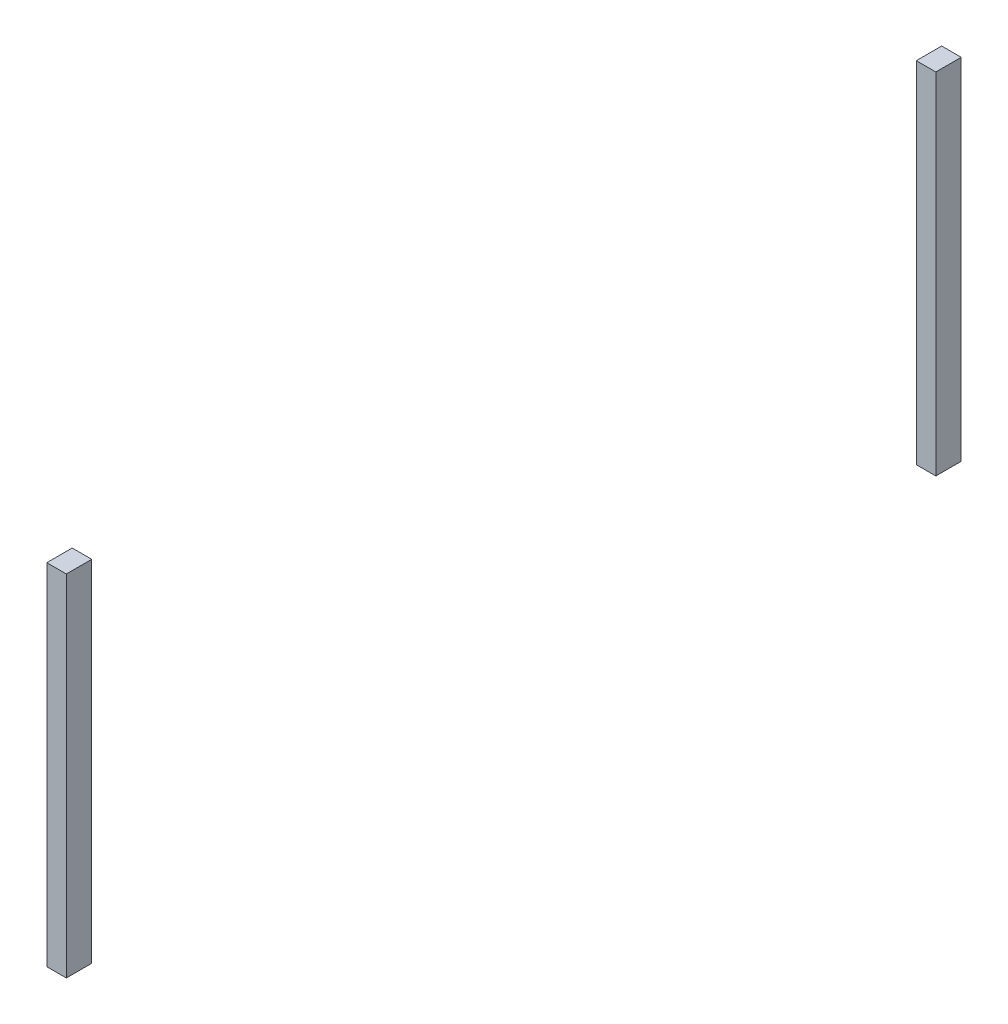
ISO-10303-21;
HEADER;
FILE_DESCRIPTION(('STEP AP214'),'2;1');
FILE_NAME('part.step','',(''),(''),'','','');
FILE_SCHEMA(('AUTOMOTIVE_DESIGN { 1 0 10303 214 1 1 1 1 }'));
ENDSEC;
DATA;
#1=APPLICATION_CONTEXT('core data for automotive mechanical design processes');
#2=APPLICATION_PROTOCOL_DEFINITION('international standard','automotive_design',2000,#1);
#3=PRODUCT_CONTEXT('',#1,'mechanical');
#4=PRODUCT('Part','Part','',(#3));
#5=PRODUCT_RELATED_PRODUCT_CATEGORY('part','',(#4));
#6=PRODUCT_DEFINITION_FORMATION('','',#4);
#7=PRODUCT_DEFINITION_CONTEXT('part definition',#1,'design');
#8=PRODUCT_DEFINITION('design','',#6,#7);
#9=PRODUCT_DEFINITION_SHAPE('','',#8);
#10=(LENGTH_UNIT() NAMED_UNIT(*) SI_UNIT(.MILLI.,.METRE.));
#11=(NAMED_UNIT(*) PLANE_ANGLE_UNIT() SI_UNIT($,.RADIAN.));
#12=(NAMED_UNIT(*) SI_UNIT($,.STERADIAN.) SOLID_ANGLE_UNIT());
#13=UNCERTAINTY_MEASURE_WITH_UNIT(LENGTH_MEASURE(1.E-05),#10,'distance_accuracy_value','');
#14=(GEOMETRIC_REPRESENTATION_CONTEXT(3) GLOBAL_UNCERTAINTY_ASSIGNED_CONTEXT((#13)) GLOBAL_UNIT_ASSIGNED_CONTEXT((#10,
#11,#12)) REPRESENTATION_CONTEXT('',''));
#15=CARTESIAN_POINT('',(0.,0.,0.));
#16=DIRECTION('',(0.,0.,1.));
#17=DIRECTION('',(1.,0.,0.));
#18=AXIS2_PLACEMENT_3D('',#15,#16,#17);
#19=CARTESIAN_POINT('',(-287.55,151.,561.6));
#20=DIRECTION('',(0.,1.,0.));
#21=DIRECTION('',(0.,0.,1.));
#22=AXIS2_PLACEMENT_3D('',#19,#20,#21);
#23=PLANE('',#22);
#24=DIRECTION('',(0.,0.,1.));
#25=VECTOR('',#24,1.);
#26=CARTESIAN_POINT('',(-256.75,151.,561.6));
#27=LINE('',#26,#25);
#28=CARTESIAN_POINT('',(-256.75,151.,561.6));
#29=VERTEX_POINT('',#28);
#30=CARTESIAN_POINT('',(-256.75,151.,601.6));
#31=VERTEX_POINT('',#30);
#32=EDGE_CURVE('E106',#29,#31,#27,.T.);
#33=ORIENTED_EDGE('',*,*,#32,.F.);
#34=DIRECTION('',(1.,0.,0.));
#35=VECTOR('',#34,1.);
#36=CARTESIAN_POINT('',(-287.55,151.,561.6));
#37=LINE('',#36,#35);
#38=CARTESIAN_POINT('',(-287.55,151.,561.6));
#39=VERTEX_POINT('',#38);
#40=EDGE_CURVE('E12',#39,#29,#37,.T.);
#41=ORIENTED_EDGE('',*,*,#40,.F.);
#42=DIRECTION('',(0.,0.,1.));
#43=VECTOR('',#42,1.);
#44=CARTESIAN_POINT('',(-287.55,151.,561.6));
#45=LINE('',#44,#43);
#46=CARTESIAN_POINT('',(-287.55,151.,601.6));
#47=VERTEX_POINT('',#46);
#48=EDGE_CURVE('E100',#39,#47,#45,.T.);
#49=ORIENTED_EDGE('',*,*,#48,.T.);
#50=DIRECTION('',(1.,0.,0.));
#51=VECTOR('',#50,1.);
#52=CARTESIAN_POINT('',(-287.55,151.,601.6));
#53=LINE('',#52,#51);
#54=EDGE_CURVE('E45',#47,#31,#53,.T.);
#55=ORIENTED_EDGE('',*,*,#54,.T.);
#56=EDGE_LOOP('',(#33,#41,#49,#55));
#57=FACE_BOUND('',#56,.T.);
#58=ADVANCED_FACE('F42',(#57),#23,.T.);
#59=CARTESIAN_POINT('',(-287.55,-400.,561.6));
#60=DIRECTION('',(0.,0.,-1.));
#61=DIRECTION('',(0.,1.,0.));
#62=AXIS2_PLACEMENT_3D('',#59,#60,#61);
#63=PLANE('',#62);
#64=DIRECTION('',(0.,1.,0.));
#65=VECTOR('',#64,1.);
#66=CARTESIAN_POINT('',(-256.75,-400.,561.6));
#67=LINE('',#66,#65);
#68=CARTESIAN_POINT('',(-256.75,-400.,561.6));
#69=VERTEX_POINT('',#68);
#70=EDGE_CURVE('E102',#69,#29,#67,.T.);
#71=ORIENTED_EDGE('',*,*,#70,.F.);
#72=DIRECTION('',(1.,0.,0.));
#73=VECTOR('',#72,1.);
#74=CARTESIAN_POINT('',(-287.55,-400.,561.6));
#75=LINE('',#74,#73);
#76=CARTESIAN_POINT('',(-287.55,-400.,561.6));
#77=VERTEX_POINT('',#76);
#78=EDGE_CURVE('E51',#77,#69,#75,.T.);
#79=ORIENTED_EDGE('',*,*,#78,.F.);
#80=DIRECTION('',(0.,1.,0.));
#81=VECTOR('',#80,1.);
#82=CARTESIAN_POINT('',(-287.55,-400.,561.6));
#83=LINE('',#82,#81);
#84=EDGE_CURVE('E97',#77,#39,#83,.T.);
#85=ORIENTED_EDGE('',*,*,#84,.T.);
#86=ORIENTED_EDGE('',*,*,#40,.T.);
#87=EDGE_LOOP('',(#71,#79,#85,#86));
#88=FACE_BOUND('',#87,.T.);
#89=ADVANCED_FACE('F116',(#88),#63,.T.);
#90=CARTESIAN_POINT('',(-287.55,-400.,601.6));
#91=DIRECTION('',(0.,-1.,0.));
#92=DIRECTION('',(0.,0.,-1.));
#93=AXIS2_PLACEMENT_3D('',#90,#91,#92);
#94=PLANE('',#93);
#95=DIRECTION('',(0.,0.,-1.));
#96=VECTOR('',#95,1.);
#97=CARTESIAN_POINT('',(-256.75,-400.,601.6));
#98=LINE('',#97,#96);
#99=CARTESIAN_POINT('',(-256.75,-400.,601.6));
#100=VERTEX_POINT('',#99);
#101=EDGE_CURVE('E92',#100,#69,#98,.T.);
#102=ORIENTED_EDGE('',*,*,#101,.F.);
#103=DIRECTION('',(1.,0.,0.));
#104=VECTOR('',#103,1.);
#105=CARTESIAN_POINT('',(-287.55,-400.,601.6));
#106=LINE('',#105,#104);
#107=CARTESIAN_POINT('',(-287.55,-400.,601.6));
#108=VERTEX_POINT('',#107);
#109=EDGE_CURVE('E87',#108,#100,#106,.T.);
#110=ORIENTED_EDGE('',*,*,#109,.F.);
#111=DIRECTION('',(0.,0.,-1.));
#112=VECTOR('',#111,1.);
#113=CARTESIAN_POINT('',(-287.55,-400.,601.6));
#114=LINE('',#113,#112);
#115=EDGE_CURVE('E90',#108,#77,#114,.T.);
#116=ORIENTED_EDGE('',*,*,#115,.T.);
#117=ORIENTED_EDGE('',*,*,#78,.T.);
#118=EDGE_LOOP('',(#102,#110,#116,#117));
#119=FACE_BOUND('',#118,.T.);
#120=ADVANCED_FACE('F89',(#119),#94,.T.);
#121=CARTESIAN_POINT('',(-287.55,151.,601.6));
#122=DIRECTION('',(0.,0.,1.));
#123=DIRECTION('',(0.,-1.,0.));
#124=AXIS2_PLACEMENT_3D('',#121,#122,#123);
#125=PLANE('',#124);
#126=DIRECTION('',(0.,-1.,0.));
#127=VECTOR('',#126,1.);
#128=CARTESIAN_POINT('',(-256.75,151.,601.6));
#129=LINE('',#128,#127);
#130=EDGE_CURVE('E109',#31,#100,#129,.T.);
#131=ORIENTED_EDGE('',*,*,#130,.F.);
#132=ORIENTED_EDGE('',*,*,#54,.F.);
#133=DIRECTION('',(0.,-1.,0.));
#134=VECTOR('',#133,1.);
#135=CARTESIAN_POINT('',(-287.55,151.,601.6));
#136=LINE('',#135,#134);
#137=EDGE_CURVE('E96',#47,#108,#136,.T.);
#138=ORIENTED_EDGE('',*,*,#137,.T.);
#139=ORIENTED_EDGE('',*,*,#109,.T.);
#140=EDGE_LOOP('',(#131,#132,#138,#139));
#141=FACE_BOUND('',#140,.T.);
#142=ADVANCED_FACE('F99',(#141),#125,.T.);
#143=CARTESIAN_POINT('',(-287.55,0.,0.));
#144=DIRECTION('',(1.,0.,0.));
#145=DIRECTION('',(0.,0.,-1.));
#146=AXIS2_PLACEMENT_3D('',#143,#144,#145);
#147=PLANE('',#146);
#148=ORIENTED_EDGE('',*,*,#48,.F.);
#149=ORIENTED_EDGE('',*,*,#84,.F.);
#150=ORIENTED_EDGE('',*,*,#115,.F.);
#151=ORIENTED_EDGE('',*,*,#137,.F.);
#152=EDGE_LOOP('',(#148,#149,#150,#151));
#153=FACE_BOUND('',#152,.T.);
#154=ADVANCED_FACE('F95',(#153),#147,.F.);
#155=CARTESIAN_POINT('',(-256.75,0.,0.));
#156=DIRECTION('',(1.,0.,0.));
#157=DIRECTION('',(0.,0.,-1.));
#158=AXIS2_PLACEMENT_3D('',#155,#156,#157);
#159=PLANE('',#158);
#160=ORIENTED_EDGE('',*,*,#32,.T.);
#161=ORIENTED_EDGE('',*,*,#130,.T.);
#162=ORIENTED_EDGE('',*,*,#101,.T.);
#163=ORIENTED_EDGE('',*,*,#70,.T.);
#164=EDGE_LOOP('',(#160,#161,#162,#163));
#165=FACE_BOUND('',#164,.T.);
#166=ADVANCED_FACE('F115',(#165),#159,.T.);
#167=CLOSED_SHELL('',(#58,#89,#120,#142,#154,#166));
#168=MANIFOLD_SOLID_BREP('B2',#167);
#169=CARTESIAN_POINT('',(-287.55,151.,1930.8));
#170=DIRECTION('',(0.,1.,0.));
#171=DIRECTION('',(0.,0.,1.));
#172=AXIS2_PLACEMENT_3D('',#169,#170,#171);
#173=PLANE('',#172);
#174=DIRECTION('',(0.,0.,1.));
#175=VECTOR('',#174,1.);
#176=CARTESIAN_POINT('',(-256.75,151.,1930.8));
#177=LINE('',#176,#175);
#178=CARTESIAN_POINT('',(-256.75,151.,1930.8));
#179=VERTEX_POINT('',#178);
#180=CARTESIAN_POINT('',(-256.75,151.,1970.8));
#181=VERTEX_POINT('',#180);
#182=EDGE_CURVE('E229',#179,#181,#177,.T.);
#183=ORIENTED_EDGE('',*,*,#182,.F.);
#184=DIRECTION('',(1.,0.,0.));
#185=VECTOR('',#184,1.);
#186=CARTESIAN_POINT('',(-287.55,151.,1930.8));
#187=LINE('',#186,#185);
#188=CARTESIAN_POINT('',(-287.55,151.,1930.8));
#189=VERTEX_POINT('',#188);
#190=EDGE_CURVE('E40',#189,#179,#187,.T.);
#191=ORIENTED_EDGE('',*,*,#190,.F.);
#192=DIRECTION('',(0.,0.,1.));
#193=VECTOR('',#192,1.);
#194=CARTESIAN_POINT('',(-287.55,151.,1930.8));
#195=LINE('',#194,#193);
#196=CARTESIAN_POINT('',(-287.55,151.,1970.8));
#197=VERTEX_POINT('',#196);
#198=EDGE_CURVE('E223',#189,#197,#195,.T.);
#199=ORIENTED_EDGE('',*,*,#198,.T.);
#200=DIRECTION('',(1.,0.,0.));
#201=VECTOR('',#200,1.);
#202=CARTESIAN_POINT('',(-287.55,151.,1970.8));
#203=LINE('',#202,#201);
#204=EDGE_CURVE('E168',#197,#181,#203,.T.);
#205=ORIENTED_EDGE('',*,*,#204,.T.);
#206=EDGE_LOOP('',(#183,#191,#199,#205));
#207=FACE_BOUND('',#206,.T.);
#208=ADVANCED_FACE('F165',(#207),#173,.T.);
#209=CARTESIAN_POINT('',(-287.55,-400.,1930.8));
#210=DIRECTION('',(0.,0.,-1.));
#211=DIRECTION('',(-1.,0.,0.));
#212=AXIS2_PLACEMENT_3D('',#209,#210,#211);
#213=PLANE('',#212);
#214=DIRECTION('',(0.,1.,0.));
#215=VECTOR('',#214,1.);
#216=CARTESIAN_POINT('',(-256.75,-400.,1930.8));
#217=LINE('',#216,#215);
#218=CARTESIAN_POINT('',(-256.75,-400.,1930.8));
#219=VERTEX_POINT('',#218);
#220=EDGE_CURVE('E225',#219,#179,#217,.T.);
#221=ORIENTED_EDGE('',*,*,#220,.F.);
#222=DIRECTION('',(1.,0.,0.));
#223=VECTOR('',#222,1.);
#224=CARTESIAN_POINT('',(-287.55,-400.,1930.8));
#225=LINE('',#224,#223);
#226=CARTESIAN_POINT('',(-287.55,-400.,1930.8));
#227=VERTEX_POINT('',#226);
#228=EDGE_CURVE('E174',#227,#219,#225,.T.);
#229=ORIENTED_EDGE('',*,*,#228,.F.);
#230=DIRECTION('',(0.,1.,0.));
#231=VECTOR('',#230,1.);
#232=CARTESIAN_POINT('',(-287.55,-400.,1930.8));
#233=LINE('',#232,#231);
#234=EDGE_CURVE('E220',#227,#189,#233,.T.);
#235=ORIENTED_EDGE('',*,*,#234,.T.);
#236=ORIENTED_EDGE('',*,*,#190,.T.);
#237=EDGE_LOOP('',(#221,#229,#235,#236));
#238=FACE_BOUND('',#237,.T.);
#239=ADVANCED_FACE('F239',(#238),#213,.T.);
#240=CARTESIAN_POINT('',(-287.55,-400.,1970.8));
#241=DIRECTION('',(0.,-1.,0.));
#242=DIRECTION('',(0.,0.,-1.));
#243=AXIS2_PLACEMENT_3D('',#240,#241,#242);
#244=PLANE('',#243);
#245=DIRECTION('',(0.,0.,-1.));
#246=VECTOR('',#245,1.);
#247=CARTESIAN_POINT('',(-256.75,-400.,1970.8));
#248=LINE('',#247,#246);
#249=CARTESIAN_POINT('',(-256.75,-400.,1970.8));
#250=VERTEX_POINT('',#249);
#251=EDGE_CURVE('E215',#250,#219,#248,.T.);
#252=ORIENTED_EDGE('',*,*,#251,.F.);
#253=DIRECTION('',(1.,0.,0.));
#254=VECTOR('',#253,1.);
#255=CARTESIAN_POINT('',(-287.55,-400.,1970.8));
#256=LINE('',#255,#254);
#257=CARTESIAN_POINT('',(-287.55,-400.,1970.8));
#258=VERTEX_POINT('',#257);
#259=EDGE_CURVE('E210',#258,#250,#256,.T.);
#260=ORIENTED_EDGE('',*,*,#259,.F.);
#261=DIRECTION('',(0.,0.,-1.));
#262=VECTOR('',#261,1.);
#263=CARTESIAN_POINT('',(-287.55,-400.,1970.8));
#264=LINE('',#263,#262);
#265=EDGE_CURVE('E213',#258,#227,#264,.T.);
#266=ORIENTED_EDGE('',*,*,#265,.T.);
#267=ORIENTED_EDGE('',*,*,#228,.T.);
#268=EDGE_LOOP('',(#252,#260,#266,#267));
#269=FACE_BOUND('',#268,.T.);
#270=ADVANCED_FACE('F212',(#269),#244,.T.);
#271=CARTESIAN_POINT('',(-287.55,151.,1970.8));
#272=DIRECTION('',(0.,0.,1.));
#273=DIRECTION('',(1.,0.,0.));
#274=AXIS2_PLACEMENT_3D('',#271,#272,#273);
#275=PLANE('',#274);
#276=DIRECTION('',(0.,-1.,0.));
#277=VECTOR('',#276,1.);
#278=CARTESIAN_POINT('',(-256.75,151.,1970.8));
#279=LINE('',#278,#277);
#280=EDGE_CURVE('E232',#181,#250,#279,.T.);
#281=ORIENTED_EDGE('',*,*,#280,.F.);
#282=ORIENTED_EDGE('',*,*,#204,.F.);
#283=DIRECTION('',(0.,-1.,0.));
#284=VECTOR('',#283,1.);
#285=CARTESIAN_POINT('',(-287.55,151.,1970.8));
#286=LINE('',#285,#284);
#287=EDGE_CURVE('E219',#197,#258,#286,.T.);
#288=ORIENTED_EDGE('',*,*,#287,.T.);
#289=ORIENTED_EDGE('',*,*,#259,.T.);
#290=EDGE_LOOP('',(#281,#282,#288,#289));
#291=FACE_BOUND('',#290,.T.);
#292=ADVANCED_FACE('F222',(#291),#275,.T.);
#293=CARTESIAN_POINT('',(-287.55,0.,0.));
#294=DIRECTION('',(1.,0.,0.));
#295=DIRECTION('',(0.,0.,-1.));
#296=AXIS2_PLACEMENT_3D('',#293,#294,#295);
#297=PLANE('',#296);
#298=ORIENTED_EDGE('',*,*,#198,.F.);
#299=ORIENTED_EDGE('',*,*,#234,.F.);
#300=ORIENTED_EDGE('',*,*,#265,.F.);
#301=ORIENTED_EDGE('',*,*,#287,.F.);
#302=EDGE_LOOP('',(#298,#299,#300,#301));
#303=FACE_BOUND('',#302,.T.);
#304=ADVANCED_FACE('F218',(#303),#297,.F.);
#305=CARTESIAN_POINT('',(-256.75,0.,0.));
#306=DIRECTION('',(1.,0.,0.));
#307=DIRECTION('',(0.,0.,-1.));
#308=AXIS2_PLACEMENT_3D('',#305,#306,#307);
#309=PLANE('',#308);
#310=ORIENTED_EDGE('',*,*,#182,.T.);
#311=ORIENTED_EDGE('',*,*,#280,.T.);
#312=ORIENTED_EDGE('',*,*,#251,.T.);
#313=ORIENTED_EDGE('',*,*,#220,.T.);
#314=EDGE_LOOP('',(#310,#311,#312,#313));
#315=FACE_BOUND('',#314,.T.);
#316=ADVANCED_FACE('F238',(#315),#309,.T.);
#317=CLOSED_SHELL('',(#208,#239,#270,#292,#304,#316));
#318=MANIFOLD_SOLID_BREP('B6',#317);
#319=ADVANCED_BREP_SHAPE_REPRESENTATION('',(#18,#168,#318),#14);
#320=SHAPE_DEFINITION_REPRESENTATION(#9,#319);
ENDSEC;
END-ISO-10303-21;
